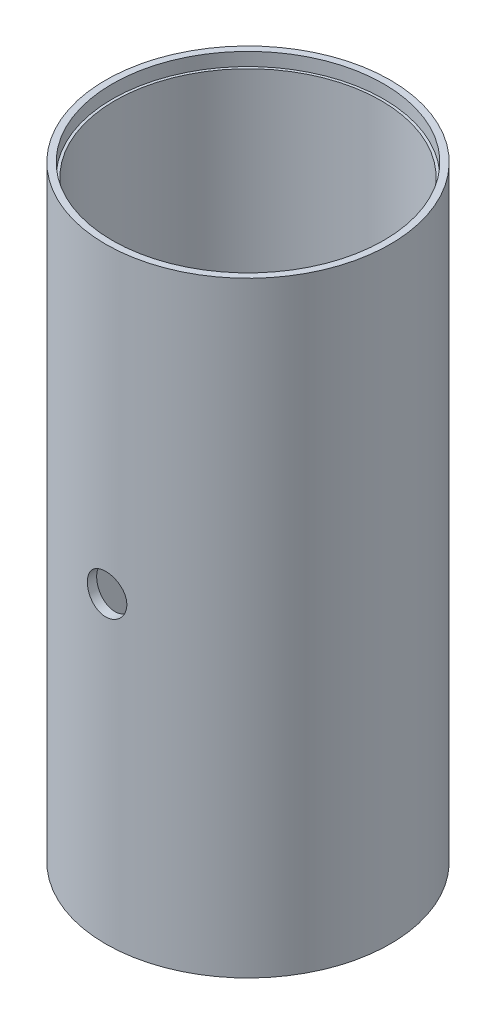
ISO-10303-21;
HEADER;
FILE_DESCRIPTION(('STEP AP214'),'2;1');
FILE_NAME('part.step','',(''),(''),'','','');
FILE_SCHEMA(('AUTOMOTIVE_DESIGN { 1 0 10303 214 1 1 1 1 }'));
ENDSEC;
DATA;
#1=APPLICATION_CONTEXT('core data for automotive mechanical design processes');
#2=APPLICATION_PROTOCOL_DEFINITION('international standard','automotive_design',2000,#1);
#3=PRODUCT_CONTEXT('',#1,'mechanical');
#4=PRODUCT('Part','Part','',(#3));
#5=PRODUCT_RELATED_PRODUCT_CATEGORY('part','',(#4));
#6=PRODUCT_DEFINITION_FORMATION('','',#4);
#7=PRODUCT_DEFINITION_CONTEXT('part definition',#1,'design');
#8=PRODUCT_DEFINITION('design','',#6,#7);
#9=PRODUCT_DEFINITION_SHAPE('','',#8);
#10=(LENGTH_UNIT() NAMED_UNIT(*) SI_UNIT(.MILLI.,.METRE.));
#11=(NAMED_UNIT(*) PLANE_ANGLE_UNIT() SI_UNIT($,.RADIAN.));
#12=(NAMED_UNIT(*) SI_UNIT($,.STERADIAN.) SOLID_ANGLE_UNIT());
#13=UNCERTAINTY_MEASURE_WITH_UNIT(LENGTH_MEASURE(1.E-05),#10,'distance_accuracy_value','');
#14=(GEOMETRIC_REPRESENTATION_CONTEXT(3) GLOBAL_UNCERTAINTY_ASSIGNED_CONTEXT((#13)) GLOBAL_UNIT_ASSIGNED_CONTEXT((#10,
#11,#12)) REPRESENTATION_CONTEXT('',''));
#15=CARTESIAN_POINT('',(0.,0.,0.));
#16=DIRECTION('',(0.,0.,1.));
#17=DIRECTION('',(1.,0.,0.));
#18=AXIS2_PLACEMENT_3D('',#15,#16,#17);
#19=CARTESIAN_POINT('',(0.,230.,0.));
#20=DIRECTION('',(0.,-1.,0.));
#21=DIRECTION('',(0.,0.,-1.));
#22=AXIS2_PLACEMENT_3D('',#19,#20,#21);
#23=CYLINDRICAL_SURFACE('',#22,50.5);
#24=CARTESIAN_POINT('',(0.,225.,0.));
#25=DIRECTION('',(0.,1.,0.));
#26=DIRECTION('',(0.,0.,1.));
#27=AXIS2_PLACEMENT_3D('',#24,#25,#26);
#28=CIRCLE('',#27,50.5);
#29=CARTESIAN_POINT('',(0.,225.,50.5));
#30=VERTEX_POINT('',#29);
#31=EDGE_CURVE('E54',#30,#30,#28,.T.);
#32=ORIENTED_EDGE('',*,*,#31,.T.);
#33=EDGE_LOOP('',(#32));
#34=FACE_BOUND('',#33,.T.);
#35=CARTESIAN_POINT('',(0.,0.,0.));
#36=DIRECTION('',(0.,1.,0.));
#37=DIRECTION('',(0.,0.,1.));
#38=AXIS2_PLACEMENT_3D('',#35,#36,#37);
#39=CIRCLE('',#38,50.5);
#40=CARTESIAN_POINT('',(0.,0.,50.5));
#41=VERTEX_POINT('',#40);
#42=EDGE_CURVE('E50',#41,#41,#39,.T.);
#43=ORIENTED_EDGE('',*,*,#42,.F.);
#44=EDGE_LOOP('',(#43));
#45=FACE_BOUND('',#44,.T.);
#46=CARTESIAN_POINT('',(-7.49999999999999,115.,49.9399639567351));
#47=CARTESIAN_POINT('',(-7.5000028288151,114.790538256674,49.939962802015));
#48=CARTESIAN_POINT('',(-7.49122222783248,114.581116236749,49.941284376752));
#49=CARTESIAN_POINT('',(-7.45617002439552,114.163708535643,49.9465300195498));
#50=CARTESIAN_POINT('',(-7.42989472041315,113.955723167841,49.9504546383618));
#51=CARTESIAN_POINT('',(-7.36002208107799,113.542605183883,49.9607977859522));
#52=CARTESIAN_POINT('',(-7.31641286887392,113.337474623736,49.9672180246134));
#53=CARTESIAN_POINT('',(-7.21218334504174,112.931588220889,49.9823687281971));
#54=CARTESIAN_POINT('',(-7.15155679376328,112.730834011994,49.9911000404407));
#55=CARTESIAN_POINT('',(-7.01382898036426,112.335420359782,50.0106091743905));
#56=CARTESIAN_POINT('',(-6.93674656761535,112.140754232926,50.0213846530457));
#57=CARTESIAN_POINT('',(-6.76659776639753,111.758561045707,50.044685291095));
#58=CARTESIAN_POINT('',(-6.67352548844304,111.571036647032,50.0572110948611));
#59=CARTESIAN_POINT('',(-6.47213717788885,111.204591195171,50.0836474649492));
#60=CARTESIAN_POINT('',(-6.36382908290348,111.025665726792,50.0975573091112));
#61=CARTESIAN_POINT('',(-6.13265350121687,110.677472033108,50.1263815629258));
#62=CARTESIAN_POINT('',(-6.00978061166348,110.508207426238,50.1412963444717));
#63=CARTESIAN_POINT('',(-5.74949720085067,110.179468091795,50.1718104063488));
#64=CARTESIAN_POINT('',(-5.61199537642108,110.020066009775,50.1874135813511));
#65=CARTESIAN_POINT('',(-5.32403932246863,109.71333060493,50.218777189266));
#66=CARTESIAN_POINT('',(-5.17358031851855,109.566001770185,50.2345376782379));
#67=CARTESIAN_POINT('',(-4.860842594911,109.284542781278,50.265762604493));
#68=CARTESIAN_POINT('',(-4.69856758325928,109.1504085173,50.2812271327449));
#69=CARTESIAN_POINT('',(-4.36321316850513,108.896176505676,50.3114372598844));
#70=CARTESIAN_POINT('',(-4.19012980331566,108.776083952278,50.3261825915618));
#71=CARTESIAN_POINT('',(-3.83360135186484,108.55033173808,50.3545987867371));
#72=CARTESIAN_POINT('',(-3.65011284578663,108.444739981025,50.3682644757663));
#73=CARTESIAN_POINT('',(-3.27478002529766,108.249401958556,50.3940591314544));
#74=CARTESIAN_POINT('',(-3.08293562988937,108.159655846784,50.4061880832126));
#75=CARTESIAN_POINT('',(-2.69226089983975,107.996677549192,50.4285633920693));
#76=CARTESIAN_POINT('',(-2.49343094763783,107.923444460955,50.4388098520381));
#77=CARTESIAN_POINT('',(-2.09019323352043,107.79403512541,50.4571285665423));
#78=CARTESIAN_POINT('',(-1.8857853858614,107.737859140465,50.4652007876343));
#79=CARTESIAN_POINT('',(-1.47442905599489,107.643352897097,50.4788875059102));
#80=CARTESIAN_POINT('',(-1.26751137441977,107.604891205062,50.4845200851058));
#81=CARTESIAN_POINT('',(-0.851054529133245,107.545473158916,50.4932580570399));
#82=CARTESIAN_POINT('',(-0.641514484486538,107.524522856876,50.496362576052));
#83=CARTESIAN_POINT('',(-0.22146366394696,107.500322094094,50.4999505683325));
#84=CARTESIAN_POINT('',(-0.0109533202636126,107.497064395634,50.5004351133836));
#85=CARTESIAN_POINT('',(0.409608333072067,107.508234065539,50.4987781225954));
#86=CARTESIAN_POINT('',(0.619659445204362,107.522667944966,50.4966356199191));
#87=CARTESIAN_POINT('',(1.24337992848646,107.592056240724,50.4863849640355));
#88=CARTESIAN_POINT('',(1.65442415348349,107.672884108161,50.4744844325517));
#89=CARTESIAN_POINT('',(2.45682059968025,107.901525207437,50.4418059601631));
#90=CARTESIAN_POINT('',(2.84817232191415,108.049340135635,50.4210277944445));
#91=CARTESIAN_POINT('',(3.60204274162461,108.408328925863,50.3727950699752));
#92=CARTESIAN_POINT('',(3.96444902839145,108.619735920117,50.3453160167875));
#93=CARTESIAN_POINT('',(4.64883461894264,109.099737022017,50.2867432133682));
#94=CARTESIAN_POINT('',(4.97081131114402,109.368334820934,50.2556492298767));
#95=CARTESIAN_POINT('',(5.56847687946529,109.958173709486,50.19296159235));
#96=CARTESIAN_POINT('',(5.84368955740042,110.279897376243,50.161366011161));
#97=CARTESIAN_POINT('',(6.33629144100722,110.965214681671,50.1015287356837));
#98=CARTESIAN_POINT('',(6.55368030376667,111.328808568626,50.0732870612857));
#99=CARTESIAN_POINT('',(6.92452720680743,112.088036991702,50.0233558523854));
#100=CARTESIAN_POINT('',(7.0779369892611,112.483695445653,50.0016712671093));
#101=CARTESIAN_POINT('',(7.31599500304379,113.295555591803,49.9673975598401));
#102=CARTESIAN_POINT('',(7.40064798022008,113.711755864026,49.9548078100946));
#103=CARTESIAN_POINT('',(7.49813813354729,114.548649831665,49.9402680036289));
#104=CARTESIAN_POINT('',(7.5116500972391,114.969263246154,49.9382179797755));
#105=CARTESIAN_POINT('',(7.46826327696458,115.806749190694,49.9447244844042));
#106=CARTESIAN_POINT('',(7.41136663323849,116.223621834067,49.9532806904842));
#107=CARTESIAN_POINT('',(7.22935436527313,117.0397035458,49.9799434638637));
#108=CARTESIAN_POINT('',(7.10457430114934,117.438989140972,49.9980030400219));
#109=CARTESIAN_POINT('',(6.79066891255121,118.210985728915,50.0416001990781));
#110=CARTESIAN_POINT('',(6.60154046801703,118.58369543204,50.0671381445715));
#111=CARTESIAN_POINT('',(6.16274739914174,119.294944447297,50.1230457877509));
#112=CARTESIAN_POINT('',(5.91264597235642,119.633211044666,50.1534497795675));
#113=CARTESIAN_POINT('',(5.3593736643792,120.2633324571,50.215577182745));
#114=CARTESIAN_POINT('',(5.05619984333535,120.555184699414,50.2473006671226));
#115=CARTESIAN_POINT('',(4.56702779588003,120.952909856058,50.2933349330618));
#116=CARTESIAN_POINT('',(4.39738188597014,121.079292559247,50.308486671941));
#117=CARTESIAN_POINT('',(4.04798629337795,121.317310054797,50.3378036539344));
#118=CARTESIAN_POINT('',(3.86824036517133,121.428950276348,50.3519692592964));
#119=CARTESIAN_POINT('',(3.49982771300651,121.636713610976,50.3789176268151));
#120=CARTESIAN_POINT('',(3.31115792686562,121.732831346898,50.3916999092702));
#121=CARTESIAN_POINT('',(2.92634143633276,121.908781523496,50.4155101587961));
#122=CARTESIAN_POINT('',(2.73019743559341,121.988619787815,50.4265387529006));
#123=CARTESIAN_POINT('',(2.33245520189121,122.131208426035,50.4464980248267));
#124=CARTESIAN_POINT('',(2.13087809864928,122.194016749473,50.4554358026617));
#125=CARTESIAN_POINT('',(1.72306701915372,122.302434782852,50.471008239667));
#126=CARTESIAN_POINT('',(1.51683315248889,122.348044897076,50.4776429529758));
#127=CARTESIAN_POINT('',(1.10119756201961,122.421718648019,50.4884202325786));
#128=CARTESIAN_POINT('',(0.891795951257891,122.449782909366,50.4925628875891));
#129=CARTESIAN_POINT('',(0.471340436333829,122.488150655517,50.4982379765938));
#130=CARTESIAN_POINT('',(0.260286569249453,122.498454537737,50.4997704689946));
#131=CARTESIAN_POINT('',(-0.159944068640156,122.501209969982,50.5001797058548));
#132=CARTESIAN_POINT('',(-0.369119734456835,122.493829270184,50.4990814051891));
#133=CARTESIAN_POINT('',(-0.786020701841528,122.46162627547,50.4943126885709));
#134=CARTESIAN_POINT('',(-0.993746487424794,122.436810112941,50.4906431769638));
#135=CARTESIAN_POINT('',(-1.40637939344364,122.369924697866,50.4808349530784));
#136=CARTESIAN_POINT('',(-1.61128600736116,122.327852385704,50.4746958029223));
#137=CARTESIAN_POINT('',(-2.01678932209608,122.226771257792,50.4601201398621));
#138=CARTESIAN_POINT('',(-2.2173861109934,122.167762788521,50.4516836739566));
#139=CARTESIAN_POINT('',(-2.61272901230158,122.033293084772,50.4327551058121));
#140=CARTESIAN_POINT('',(-2.80747911738034,121.957843382747,50.4222644449773));
#141=CARTESIAN_POINT('',(-3.18992340783237,121.79101704096,50.3995147644383));
#142=CARTESIAN_POINT('',(-3.3776176468737,121.69964052237,50.3872557581879));
#143=CARTESIAN_POINT('',(-3.74470080620406,121.501593505361,50.3613054222252));
#144=CARTESIAN_POINT('',(-3.92408802634284,121.394919894316,50.3476138011604));
#145=CARTESIAN_POINT('',(-4.27323193823212,121.167084141797,50.3191828370525));
#146=CARTESIAN_POINT('',(-4.44299202281114,121.045927151982,50.3044438672977));
#147=CARTESIAN_POINT('',(-4.77337283422013,120.788709419026,50.2741752393747));
#148=CARTESIAN_POINT('',(-4.93389081256685,120.65251741004,50.258639374977));
#149=CARTESIAN_POINT('',(-5.24284799451752,120.367191626847,50.2273496347002));
#150=CARTESIAN_POINT('',(-5.39129152204329,120.218062525366,50.2115958392491));
#151=CARTESIAN_POINT('',(-5.67522461713713,119.907756975132,50.1802973621651));
#152=CARTESIAN_POINT('',(-5.81070634009986,119.746573334677,50.1647528119982));
#153=CARTESIAN_POINT('',(-6.06762200597599,119.413411147216,50.1343265242732));
#154=CARTESIAN_POINT('',(-6.18906111555874,119.24143660664,50.1194445441846));
#155=CARTESIAN_POINT('',(-6.41776498425645,118.886781968442,50.090674387107));
#156=CARTESIAN_POINT('',(-6.52494205407552,118.704044787145,50.0767925791109));
#157=CARTESIAN_POINT('',(-6.7234599255477,118.330146352618,50.0505255962442));
#158=CARTESIAN_POINT('',(-6.81480654704577,118.138988227785,50.0381398718688));
#159=CARTESIAN_POINT('',(-6.98097764442323,117.749673638726,50.0152275803672));
#160=CARTESIAN_POINT('',(-7.05581429005828,117.551522455012,50.0046996449896));
#161=CARTESIAN_POINT('',(-7.18847208988267,117.1495737491,49.9858014315412));
#162=CARTESIAN_POINT('',(-7.24629707139625,116.945777508246,49.9774306681973));
#163=CARTESIAN_POINT('',(-7.36325517683334,116.455321086234,49.9603569391541));
#164=CARTESIAN_POINT('',(-7.41447740891881,116.166699047704,49.9527446852401));
#165=CARTESIAN_POINT('',(-7.48284763026817,115.585358792924,49.9425490322708));
#166=CARTESIAN_POINT('',(-7.49999604784044,115.292640628209,49.9399655700036));
#167=CARTESIAN_POINT('',(-7.49999999999999,115.,49.9399639567351));
#168=B_SPLINE_CURVE_WITH_KNOTS('',3,(#46,#47,#48,#49,#50,#51,#52,#53,#54,#55,#56,#57,#58,#59,
#60,#61,#62,#63,#64,#65,#66,#67,#68,#69,#70,#71,#72,#73,#74,#75,#76,#77,#78,#79,#80,#81,#82,#83,
#84,#85,#86,#87,#88,#89,#90,#91,#92,#93,#94,#95,#96,#97,#98,#99,#100,#101,#102,#103,#104,#105,
#106,#107,#108,#109,#110,#111,#112,#113,#114,#115,#116,#117,#118,#119,#120,#121,#122,#123,#124,
#125,#126,#127,#128,#129,#130,#131,#132,#133,#134,#135,#136,#137,#138,#139,#140,#141,#142,#143,
#144,#145,#146,#147,#148,#149,#150,#151,#152,#153,#154,#155,#156,#157,#158,#159,#160,#161,#162,
#163,#164,#165,#166,#167),.UNSPECIFIED.,.T.,.F.,(4,2,2,2,2,2,2,2,2,2,2,2,2,2,2,2,2,2,2,2,2,2,2,
2,2,2,2,2,2,2,2,2,2,2,2,2,2,2,2,2,2,2,2,2,2,2,2,2,2,2,2,2,2,2,2,2,2,2,2,2,4),(0.,
0.628128838751359,1.25639061920806,1.88508361632351,2.51400743450676,3.14221468041044,
3.77065380949923,4.39876673625427,5.0271133967861,5.65964156562699,6.29240381228593,
6.92496833926134,7.55776612637708,8.19343286573769,8.82910576828496,9.46474392360915,
10.1003918554901,10.7312443645625,11.3623148110435,11.9931270787807,12.6241715751849,
13.8749650331886,15.1257901676772,16.3812579752294,17.6368068390847,18.9044606881478,
20.172122054603,21.4407378646598,22.70926610275,23.9657401179327,25.2221759404813,
26.4724566702899,27.7227980310997,28.9823744076446,30.2420205782985,30.877666671723,
31.5130780200716,32.1487090116862,32.7841122190084,33.4173253373975,34.0505235697181,
34.6836992590554,35.316860779916,35.9440401507679,36.5709990409579,37.1980691427236,
37.825126416838,38.4517452589465,39.0783593339246,39.7051010927044,40.3316205825091,
40.9641225781021,41.5963970651053,42.229051821459,42.8614730608118,43.4976188314275,
44.1335302334386,44.768971317546,45.4042693291004,46.2818440387531,47.1594077172082),.UNSPECIFIED.);
#169=CARTESIAN_POINT('',(-7.49999999999999,115.,49.9399639567351));
#170=VERTEX_POINT('',#169);
#171=EDGE_CURVE('E66',#170,#170,#168,.T.);
#172=ORIENTED_EDGE('',*,*,#171,.T.);
#173=EDGE_LOOP('',(#172));
#174=FACE_BOUND('',#173,.T.);
#175=ADVANCED_FACE('F33',(#34,#45,#174),#23,.F.);
#176=CARTESIAN_POINT('',(0.,230.,0.));
#177=DIRECTION('',(0.,-1.,0.));
#178=DIRECTION('',(0.,0.,-1.));
#179=AXIS2_PLACEMENT_3D('',#176,#177,#178);
#180=CYLINDRICAL_SURFACE('',#179,54.);
#181=CARTESIAN_POINT('',(0.,0.,0.));
#182=DIRECTION('',(0.,1.,0.));
#183=DIRECTION('',(0.,0.,1.));
#184=AXIS2_PLACEMENT_3D('',#181,#182,#183);
#185=CIRCLE('',#184,54.);
#186=CARTESIAN_POINT('',(0.,0.,54.));
#187=VERTEX_POINT('',#186);
#188=EDGE_CURVE('E45',#187,#187,#185,.T.);
#189=ORIENTED_EDGE('',*,*,#188,.T.);
#190=EDGE_LOOP('',(#189));
#191=FACE_BOUND('',#190,.T.);
#192=CARTESIAN_POINT('',(0.,230.,0.));
#193=DIRECTION('',(0.,1.,0.));
#194=DIRECTION('',(0.,0.,1.));
#195=AXIS2_PLACEMENT_3D('',#192,#193,#194);
#196=CIRCLE('',#195,54.);
#197=CARTESIAN_POINT('',(0.,230.,54.));
#198=VERTEX_POINT('',#197);
#199=EDGE_CURVE('E10',#198,#198,#196,.T.);
#200=ORIENTED_EDGE('',*,*,#199,.F.);
#201=EDGE_LOOP('',(#200));
#202=FACE_BOUND('',#201,.T.);
#203=CARTESIAN_POINT('',(-7.49999999999999,115.,53.4766304099277));
#204=CARTESIAN_POINT('',(-7.50000264462229,114.790380642073,53.4766293988424));
#205=CARTESIAN_POINT('',(-7.49120892141316,114.580799124084,53.4778653819371));
#206=CARTESIAN_POINT('',(-7.45610315756288,114.163071261579,53.4827715908549));
#207=CARTESIAN_POINT('',(-7.42978729570284,113.954925240121,53.4864423476517));
#208=CARTESIAN_POINT('',(-7.35980399814625,113.541479466486,53.4961169288541));
#209=CARTESIAN_POINT('',(-7.31612422102879,113.33618184645,53.5021224126024));
#210=CARTESIAN_POINT('',(-7.21172211651183,112.929962130986,53.5162950714797));
#211=CARTESIAN_POINT('',(-7.15099354111982,112.729041668829,53.5244630390466));
#212=CARTESIAN_POINT('',(-7.0130261092822,112.333292142203,53.5427146923181));
#213=CARTESIAN_POINT('',(-6.93580552671648,112.138456607043,53.5527962563081));
#214=CARTESIAN_POINT('',(-6.7653451385264,111.755933640087,53.5745973946647));
#215=CARTESIAN_POINT('',(-6.67209943138312,111.5682488729,53.5863175721804));
#216=CARTESIAN_POINT('',(-6.4703308354713,111.201500322819,53.6110542552771));
#217=CARTESIAN_POINT('',(-6.36181608702343,111.022432014092,53.6240700690462));
#218=CARTESIAN_POINT('',(-6.13019496694707,110.673974797786,53.651041955265));
#219=CARTESIAN_POINT('',(-6.00708318587724,110.504589513273,53.6649983754573));
#220=CARTESIAN_POINT('',(-5.74640553065562,110.175780426943,53.6935387955123));
#221=CARTESIAN_POINT('',(-5.60876017193963,110.016419909757,53.7081259584157));
#222=CARTESIAN_POINT('',(-5.32051609099554,109.709782332126,53.7374459390306));
#223=CARTESIAN_POINT('',(-5.16991259521916,109.562509764041,53.7521788086338));
#224=CARTESIAN_POINT('',(-4.85689016284145,109.281181417382,53.7813658487543));
#225=CARTESIAN_POINT('',(-4.69447496118319,109.147121492185,53.7958201055578));
#226=CARTESIAN_POINT('',(-4.35884933325708,108.893057471291,53.824054077703));
#227=CARTESIAN_POINT('',(-4.18563494778353,108.773058577639,53.8378335423068));
#228=CARTESIAN_POINT('',(-3.82896666767322,108.547581753039,53.8643770264));
#229=CARTESIAN_POINT('',(-3.64547523774984,108.442162689365,53.8771368462538));
#230=CARTESIAN_POINT('',(-3.27016501724023,108.247167911106,53.9012186796393));
#231=CARTESIAN_POINT('',(-3.07834613984385,108.157592361732,53.9125406781776));
#232=CARTESIAN_POINT('',(-2.68775087501304,107.994948477268,53.9334241292902));
#233=CARTESIAN_POINT('',(-2.48897483887913,107.921879310077,53.9429856706063));
#234=CARTESIAN_POINT('',(-2.08587271740755,107.792786607839,53.9600762407074));
#235=CARTESIAN_POINT('',(-1.8815465410928,107.736763352391,53.9676052361529));
#236=CARTESIAN_POINT('',(-1.47018928215569,107.642502433066,53.9803723684356));
#237=CARTESIAN_POINT('',(-1.26318513504259,107.604149249011,53.9856253709823));
#238=CARTESIAN_POINT('',(-0.846571077641813,107.544960921305,53.9937658513025));
#239=CARTESIAN_POINT('',(-0.636960291623351,107.524131835782,53.996652511016));
#240=CARTESIAN_POINT('',(-0.216780103542039,107.500183626798,53.9999730259896));
#241=CARTESIAN_POINT('',(-0.00621112182931679,107.497057369838,54.000407869229));
#242=CARTESIAN_POINT('',(0.414457301197496,107.508499155503,53.9988205315488));
#243=CARTESIAN_POINT('',(0.624556541029995,107.523073715002,53.9967974456984));
#244=CARTESIAN_POINT('',(1.24882176873592,107.592941551716,53.9871457945264));
#245=CARTESIAN_POINT('',(1.66034464130675,107.674191001371,53.975960186526));
#246=CARTESIAN_POINT('',(2.46362877684583,107.903852014256,53.9452742545739));
#247=CARTESIAN_POINT('',(2.85538959137529,108.052265100797,53.9257737420359));
#248=CARTESIAN_POINT('',(3.60980224944076,108.412547584694,53.8805400620678));
#249=CARTESIAN_POINT('',(3.97235444448924,108.624623435955,53.8547866697371));
#250=CARTESIAN_POINT('',(4.65689100761479,109.106060245099,53.7999211837417));
#251=CARTESIAN_POINT('',(4.9788730802845,109.375424441971,53.7708089002135));
#252=CARTESIAN_POINT('',(5.57599990407119,109.96649560384,53.7121881999558));
#253=CARTESIAN_POINT('',(5.85072668873084,110.288624901201,53.6826785131318));
#254=CARTESIAN_POINT('',(6.34228187856151,110.974639891756,53.6268296500401));
#255=CARTESIAN_POINT('',(6.55911001671299,111.338525777513,53.6004904883946));
#256=CARTESIAN_POINT('',(6.92875569834937,112.098130676835,53.5539656890094));
#257=CARTESIAN_POINT('',(7.08153471208619,112.493868681424,53.5337837572288));
#258=CARTESIAN_POINT('',(7.31834764117132,113.305727978979,53.5019270524316));
#259=CARTESIAN_POINT('',(7.40238568035973,113.721848047619,53.4902517690972));
#260=CARTESIAN_POINT('',(7.49876751599325,114.558952816425,53.4768255628205));
#261=CARTESIAN_POINT('',(7.51170185381292,114.97986826107,53.4749928964107));
#262=CARTESIAN_POINT('',(7.46707072716114,115.817860996316,53.4812428842215));
#263=CARTESIAN_POINT('',(7.40950712871812,116.234938388214,53.4893252759978));
#264=CARTESIAN_POINT('',(7.22601798440195,117.051611102509,53.5144195448879));
#265=CARTESIAN_POINT('',(7.10038277538054,117.451272938864,53.5313934879091));
#266=CARTESIAN_POINT('',(6.78460004092257,118.223870424012,53.5723284474101));
#267=CARTESIAN_POINT('',(6.59444975271179,118.596804927412,53.5962897631089));
#268=CARTESIAN_POINT('',(6.15366465305193,119.307977666755,53.6486895125021));
#269=CARTESIAN_POINT('',(5.90264556655079,119.645975193299,53.6771559747432));
#270=CARTESIAN_POINT('',(5.34754531119014,120.275375782794,53.7352883940443));
#271=CARTESIAN_POINT('',(5.04346158164182,120.566776595872,53.7649544089368));
#272=CARTESIAN_POINT('',(4.55315055377472,120.963528815718,53.8079562887523));
#273=CARTESIAN_POINT('',(4.38325953203149,121.089480655068,53.822094762199));
#274=CARTESIAN_POINT('',(4.03342066800566,121.326617543073,53.8494404476966));
#275=CARTESIAN_POINT('',(3.8534765633899,121.437808028665,53.8626480017805));
#276=CARTESIAN_POINT('',(3.48471855721625,121.644657044603,53.8877621711747));
#277=CARTESIAN_POINT('',(3.29590160195664,121.740310176346,53.8996683338362));
#278=CARTESIAN_POINT('',(2.91084459227231,121.915322423132,53.9218337039924));
#279=CARTESIAN_POINT('',(2.71460721101057,121.994687340913,53.9320934977272));
#280=CARTESIAN_POINT('',(2.31665488795305,122.136356572926,53.9506502664022));
#281=CARTESIAN_POINT('',(2.11495850392233,122.198712247544,53.9589531398157));
#282=CARTESIAN_POINT('',(1.70695885611575,122.3062161457,53.9734004326575));
#283=CARTESIAN_POINT('',(1.5006557001252,122.351364771389,53.97954490253));
#284=CARTESIAN_POINT('',(1.08492820777644,122.424113422405,53.9895004570823));
#285=CARTESIAN_POINT('',(0.875503960563555,122.451713947965,53.9933116082766));
#286=CARTESIAN_POINT('',(0.455047592331695,122.489157263752,53.9984919351651));
#287=CARTESIAN_POINT('',(0.244015505905054,122.499000434947,53.9998611632486));
#288=CARTESIAN_POINT('',(-0.17638711982961,122.500847211437,54.0001176765535));
#289=CARTESIAN_POINT('',(-0.385757018433081,122.49299717835,53.9990253244579));
#290=CARTESIAN_POINT('',(-0.803007379528533,122.459823265021,53.9944320663078));
#291=CARTESIAN_POINT('',(-1.01088833871947,122.43450551518,53.9909320052545));
#292=CARTESIAN_POINT('',(-1.42379234708125,122.366586672891,53.9816215904063));
#293=CARTESIAN_POINT('',(-1.62881487842765,122.323982489905,53.9758108234978));
#294=CARTESIAN_POINT('',(-2.03450902859612,122.221809271022,53.9620419342452));
#295=CARTESIAN_POINT('',(-2.23518073765451,122.162240587333,53.9540838564825));
#296=CARTESIAN_POINT('',(-2.63066327586221,122.026612856411,53.9362473231124));
#297=CARTESIAN_POINT('',(-2.82547716306158,121.950562589697,53.9263698903248));
#298=CARTESIAN_POINT('',(-3.20799916426584,121.782505654784,53.9049667582078));
#299=CARTESIAN_POINT('',(-3.39570733902805,121.690499123055,53.893441072976));
#300=CARTESIAN_POINT('',(-3.76276214928252,121.491166727162,53.8690585020546));
#301=CARTESIAN_POINT('',(-3.94210712137671,121.383837832554,53.8562013531678));
#302=CARTESIAN_POINT('',(-4.29110501935068,121.154671562538,53.8295183029071));
#303=CARTESIAN_POINT('',(-4.46076137719384,121.032839372347,53.8156927484808));
#304=CARTESIAN_POINT('',(-4.79068125392932,120.77439621961,53.7873314249223));
#305=CARTESIAN_POINT('',(-4.95085358941207,120.637669386958,53.7727906533273));
#306=CARTESIAN_POINT('',(-5.25907294107741,120.351297818716,53.7435215985473));
#307=CARTESIAN_POINT('',(-5.40712431274773,120.201657763354,53.7287933849344));
#308=CARTESIAN_POINT('',(-5.69022523387507,119.890360521191,53.6995493978907));
#309=CARTESIAN_POINT('',(-5.8252668931022,119.728696145793,53.685033757852));
#310=CARTESIAN_POINT('',(-6.08125494648202,119.394611241841,53.6566391268408));
#311=CARTESIAN_POINT('',(-6.20220652635397,119.222194706614,53.642759902789));
#312=CARTESIAN_POINT('',(-6.42980443003498,118.866828742677,53.6159567575036));
#313=CARTESIAN_POINT('',(-6.53637364577812,118.683829514112,53.6030381402984));
#314=CARTESIAN_POINT('',(-6.7336574519197,118.309472615112,53.578612689816));
#315=CARTESIAN_POINT('',(-6.82437786496678,118.118118046754,53.5671053385226));
#316=CARTESIAN_POINT('',(-6.9892839574153,117.728483281662,53.5458385433763));
#317=CARTESIAN_POINT('',(-7.06348213250071,117.530208450873,53.5360777796931));
#318=CARTESIAN_POINT('',(-7.19486042233527,117.128081748698,53.5185796042721));
#319=CARTESIAN_POINT('',(-7.2520444463789,116.924231170209,53.5108417277909));
#320=CARTESIAN_POINT('',(-7.36668217961572,116.437132214019,53.4952010740888));
#321=CARTESIAN_POINT('',(-7.41662252853947,116.152050679629,53.4882681211556));
#322=CARTESIAN_POINT('',(-7.48327944543734,115.577955437685,53.4789835094459));
#323=CARTESIAN_POINT('',(-7.49999635462173,115.288941770546,53.4766318036194));
#324=CARTESIAN_POINT('',(-7.49999999999999,115.,53.4766304099277));
#325=B_SPLINE_CURVE_WITH_KNOTS('',3,(#203,#204,#205,#206,#207,#208,#209,#210,#211,#212,#213,
#214,#215,#216,#217,#218,#219,#220,#221,#222,#223,#224,#225,#226,#227,#228,#229,#230,#231,#232,
#233,#234,#235,#236,#237,#238,#239,#240,#241,#242,#243,#244,#245,#246,#247,#248,#249,#250,#251,
#252,#253,#254,#255,#256,#257,#258,#259,#260,#261,#262,#263,#264,#265,#266,#267,#268,#269,#270,
#271,#272,#273,#274,#275,#276,#277,#278,#279,#280,#281,#282,#283,#284,#285,#286,#287,#288,#289,
#290,#291,#292,#293,#294,#295,#296,#297,#298,#299,#300,#301,#302,#303,#304,#305,#306,#307,#308,
#309,#310,#311,#312,#313,#314,#315,#316,#317,#318,#319,#320,#321,#322,#323,#324),.UNSPECIFIED.,
.T.,.F.,(4,2,2,2,2,2,2,2,2,2,2,2,2,2,2,2,2,2,2,2,2,2,2,2,2,2,2,2,2,2,2,2,2,2,2,2,2,2,2,2,2,2,2,
2,2,2,2,2,2,2,2,2,2,2,2,2,2,2,2,2,4),(0.,0.628605036500604,1.25734720378006,1.8865370514978,
2.51595778450971,3.14468467649607,3.77364360573212,4.40226848228474,5.03112705022012,
5.66362297241154,6.2963529007426,6.92888361819338,7.56164761401002,8.196896184006,
8.83215137779364,9.46737454062693,10.1026081222338,10.7336277079677,11.3648653493388,
11.9958486102352,12.6270642493921,13.8794411250875,15.1318464068309,16.3883578519237,
17.6449403569888,18.9121217718715,20.1793090306965,21.4472574956805,22.7151298895829,
23.9724560635264,25.2297489576919,26.4817210223633,27.7337467078757,28.9938924215723,
30.2540989617178,30.8893554977416,31.5243774015304,32.1596194799437,32.7946348566113,
33.4277109909012,34.0607723285047,34.693815618989,35.3268453279224,35.9546577288857,
36.5822499073041,37.209954338646,37.8376457388804,38.465003556635,39.0923560089617,
39.7198327108651,40.3470857473552,40.9796237197282,41.6119333921742,42.244624169767,
42.877081350929,43.5128049606091,44.1482945200949,44.7833018172841,45.4181630977282,
46.2846485188206,47.1511250409172),.UNSPECIFIED.);
#326=CARTESIAN_POINT('',(-7.49999999999999,115.,53.4766304099277));
#327=VERTEX_POINT('',#326);
#328=EDGE_CURVE('E38',#327,#327,#325,.T.);
#329=ORIENTED_EDGE('',*,*,#328,.F.);
#330=EDGE_LOOP('',(#329));
#331=FACE_BOUND('',#330,.T.);
#332=ADVANCED_FACE('F35',(#191,#202,#331),#180,.T.);
#333=CARTESIAN_POINT('',(0.,230.,0.));
#334=DIRECTION('',(0.,1.,0.));
#335=DIRECTION('',(0.,0.,1.));
#336=AXIS2_PLACEMENT_3D('',#333,#334,#335);
#337=PLANE('',#336);
#338=CARTESIAN_POINT('',(0.,230.,0.));
#339=DIRECTION('',(0.,1.,0.));
#340=DIRECTION('',(0.,0.,1.));
#341=AXIS2_PLACEMENT_3D('',#338,#339,#340);
#342=CIRCLE('',#341,51.5);
#343=CARTESIAN_POINT('',(0.,230.,51.5));
#344=VERTEX_POINT('',#343);
#345=EDGE_CURVE('E61',#344,#344,#342,.T.);
#346=ORIENTED_EDGE('',*,*,#345,.F.);
#347=EDGE_LOOP('',(#346));
#348=FACE_BOUND('',#347,.T.);
#349=ORIENTED_EDGE('',*,*,#199,.T.);
#350=EDGE_LOOP('',(#349));
#351=FACE_BOUND('',#350,.T.);
#352=ADVANCED_FACE('F91',(#348,#351),#337,.T.);
#353=CARTESIAN_POINT('',(0.,0.,0.));
#354=DIRECTION('',(0.,1.,0.));
#355=DIRECTION('',(0.,0.,1.));
#356=AXIS2_PLACEMENT_3D('',#353,#354,#355);
#357=PLANE('',#356);
#358=ORIENTED_EDGE('',*,*,#188,.F.);
#359=EDGE_LOOP('',(#358));
#360=FACE_BOUND('',#359,.T.);
#361=ORIENTED_EDGE('',*,*,#42,.T.);
#362=EDGE_LOOP('',(#361));
#363=FACE_BOUND('',#362,.T.);
#364=ADVANCED_FACE('F86',(#360,#363),#357,.F.);
#365=CARTESIAN_POINT('',(0.,225.,0.));
#366=DIRECTION('',(0.,1.,0.));
#367=DIRECTION('',(0.,0.,1.));
#368=AXIS2_PLACEMENT_3D('',#365,#366,#367);
#369=CYLINDRICAL_SURFACE('',#368,51.5);
#370=CARTESIAN_POINT('',(0.,225.,0.));
#371=DIRECTION('',(0.,1.,0.));
#372=DIRECTION('',(0.,0.,1.));
#373=AXIS2_PLACEMENT_3D('',#370,#371,#372);
#374=CIRCLE('',#373,51.5);
#375=CARTESIAN_POINT('',(0.,225.,51.5));
#376=VERTEX_POINT('',#375);
#377=EDGE_CURVE('E56',#376,#376,#374,.T.);
#378=ORIENTED_EDGE('',*,*,#377,.F.);
#379=EDGE_LOOP('',(#378));
#380=FACE_BOUND('',#379,.T.);
#381=ORIENTED_EDGE('',*,*,#345,.T.);
#382=EDGE_LOOP('',(#381));
#383=FACE_BOUND('',#382,.T.);
#384=ADVANCED_FACE('F83',(#380,#383),#369,.F.);
#385=CARTESIAN_POINT('',(0.,225.,0.));
#386=DIRECTION('',(0.,1.,0.));
#387=DIRECTION('',(0.,0.,1.));
#388=AXIS2_PLACEMENT_3D('',#385,#386,#387);
#389=PLANE('',#388);
#390=ORIENTED_EDGE('',*,*,#31,.F.);
#391=EDGE_LOOP('',(#390));
#392=FACE_BOUND('',#391,.T.);
#393=ORIENTED_EDGE('',*,*,#377,.T.);
#394=EDGE_LOOP('',(#393));
#395=FACE_BOUND('',#394,.T.);
#396=ADVANCED_FACE('F79',(#392,#395),#389,.T.);
#397=CARTESIAN_POINT('',(0.,115.,101.));
#398=DIRECTION('',(0.,0.,-1.));
#399=DIRECTION('',(-1.,0.,0.));
#400=AXIS2_PLACEMENT_3D('',#397,#398,#399);
#401=CYLINDRICAL_SURFACE('',#400,7.50000000000001);
#402=ORIENTED_EDGE('',*,*,#171,.F.);
#403=EDGE_LOOP('',(#402));
#404=FACE_BOUND('',#403,.T.);
#405=ORIENTED_EDGE('',*,*,#328,.T.);
#406=EDGE_LOOP('',(#405));
#407=FACE_BOUND('',#406,.T.);
#408=ADVANCED_FACE('F75',(#404,#407),#401,.F.);
#409=CLOSED_SHELL('',(#175,#332,#352,#364,#384,#396,#408));
#410=MANIFOLD_SOLID_BREP('B2',#409);
#411=ADVANCED_BREP_SHAPE_REPRESENTATION('',(#18,#410),#14);
#412=SHAPE_DEFINITION_REPRESENTATION(#9,#411);
ENDSEC;
END-ISO-10303-21;
